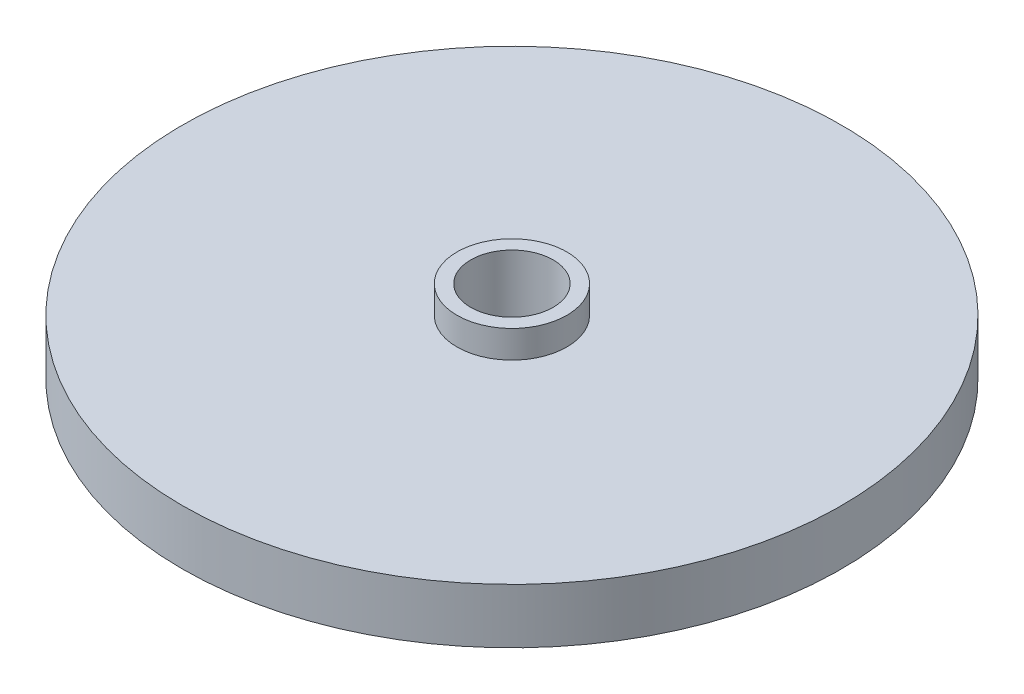
ISO-10303-21;
HEADER;
FILE_DESCRIPTION(('STEP AP214'),'2;1');
FILE_NAME('part.step','',(''),(''),'','','');
FILE_SCHEMA(('AUTOMOTIVE_DESIGN { 1 0 10303 214 1 1 1 1 }'));
ENDSEC;
DATA;
#1=APPLICATION_CONTEXT('core data for automotive mechanical design processes');
#2=APPLICATION_PROTOCOL_DEFINITION('international standard','automotive_design',2000,#1);
#3=PRODUCT_CONTEXT('',#1,'mechanical');
#4=PRODUCT('Part','Part','',(#3));
#5=PRODUCT_RELATED_PRODUCT_CATEGORY('part','',(#4));
#6=PRODUCT_DEFINITION_FORMATION('','',#4);
#7=PRODUCT_DEFINITION_CONTEXT('part definition',#1,'design');
#8=PRODUCT_DEFINITION('design','',#6,#7);
#9=PRODUCT_DEFINITION_SHAPE('','',#8);
#10=(LENGTH_UNIT() NAMED_UNIT(*) SI_UNIT(.MILLI.,.METRE.));
#11=(NAMED_UNIT(*) PLANE_ANGLE_UNIT() SI_UNIT($,.RADIAN.));
#12=(NAMED_UNIT(*) SI_UNIT($,.STERADIAN.) SOLID_ANGLE_UNIT());
#13=UNCERTAINTY_MEASURE_WITH_UNIT(LENGTH_MEASURE(1.E-05),#10,'distance_accuracy_value','');
#14=(GEOMETRIC_REPRESENTATION_CONTEXT(3) GLOBAL_UNCERTAINTY_ASSIGNED_CONTEXT((#13)) GLOBAL_UNIT_ASSIGNED_CONTEXT((#10,
#11,#12)) REPRESENTATION_CONTEXT('',''));
#15=CARTESIAN_POINT('',(0.,0.,0.));
#16=DIRECTION('',(0.,0.,1.));
#17=DIRECTION('',(1.,0.,0.));
#18=AXIS2_PLACEMENT_3D('',#15,#16,#17);
#19=CARTESIAN_POINT('',(0.,-2.,0.));
#20=DIRECTION('',(0.,1.,0.));
#21=DIRECTION('',(0.,0.,1.));
#22=AXIS2_PLACEMENT_3D('',#19,#20,#21);
#23=CYLINDRICAL_SURFACE('',#22,12.);
#24=CARTESIAN_POINT('',(0.,-2.,0.));
#25=DIRECTION('',(0.,1.,0.));
#26=DIRECTION('',(0.,0.,1.));
#27=AXIS2_PLACEMENT_3D('',#24,#25,#26);
#28=CIRCLE('',#27,12.);
#29=CARTESIAN_POINT('',(0.,-2.,12.));
#30=VERTEX_POINT('',#29);
#31=EDGE_CURVE('E43',#30,#30,#28,.T.);
#32=ORIENTED_EDGE('',*,*,#31,.T.);
#33=EDGE_LOOP('',(#32));
#34=FACE_BOUND('',#33,.T.);
#35=CARTESIAN_POINT('',(0.,0.,0.));
#36=DIRECTION('',(0.,1.,0.));
#37=DIRECTION('',(0.,0.,1.));
#38=AXIS2_PLACEMENT_3D('',#35,#36,#37);
#39=CIRCLE('',#38,12.);
#40=CARTESIAN_POINT('',(0.,0.,12.));
#41=VERTEX_POINT('',#40);
#42=EDGE_CURVE('E39',#41,#41,#39,.T.);
#43=ORIENTED_EDGE('',*,*,#42,.F.);
#44=EDGE_LOOP('',(#43));
#45=FACE_BOUND('',#44,.T.);
#46=ADVANCED_FACE('F36',(#34,#45),#23,.T.);
#47=CARTESIAN_POINT('',(0.,-2.,0.));
#48=DIRECTION('',(0.,1.,0.));
#49=DIRECTION('',(0.,0.,1.));
#50=AXIS2_PLACEMENT_3D('',#47,#48,#49);
#51=PLANE('',#50);
#52=CARTESIAN_POINT('',(0.,-2.,0.));
#53=DIRECTION('',(0.,-1.,0.));
#54=DIRECTION('',(0.,0.,-1.));
#55=AXIS2_PLACEMENT_3D('',#52,#53,#54);
#56=CIRCLE('',#55,4.5);
#57=CARTESIAN_POINT('',(0.,-2.,-4.5));
#58=VERTEX_POINT('',#57);
#59=EDGE_CURVE('E10',#58,#58,#56,.T.);
#60=ORIENTED_EDGE('',*,*,#59,.F.);
#61=EDGE_LOOP('',(#60));
#62=FACE_BOUND('',#61,.T.);
#63=ORIENTED_EDGE('',*,*,#31,.F.);
#64=EDGE_LOOP('',(#63));
#65=FACE_BOUND('',#64,.T.);
#66=ADVANCED_FACE('F84',(#62,#65),#51,.F.);
#67=CARTESIAN_POINT('',(0.,0.,0.));
#68=DIRECTION('',(0.,1.,0.));
#69=DIRECTION('',(0.,0.,1.));
#70=AXIS2_PLACEMENT_3D('',#67,#68,#69);
#71=PLANE('',#70);
#72=CARTESIAN_POINT('',(0.,0.,0.));
#73=DIRECTION('',(0.,1.,0.));
#74=DIRECTION('',(0.,0.,1.));
#75=AXIS2_PLACEMENT_3D('',#72,#73,#74);
#76=CIRCLE('',#75,2.);
#77=CARTESIAN_POINT('',(0.,0.,2.));
#78=VERTEX_POINT('',#77);
#79=EDGE_CURVE('E56',#78,#78,#76,.T.);
#80=ORIENTED_EDGE('',*,*,#79,.F.);
#81=EDGE_LOOP('',(#80));
#82=FACE_BOUND('',#81,.T.);
#83=ORIENTED_EDGE('',*,*,#42,.T.);
#84=EDGE_LOOP('',(#83));
#85=FACE_BOUND('',#84,.T.);
#86=ADVANCED_FACE('F89',(#82,#85),#71,.T.);
#87=CARTESIAN_POINT('',(0.,-4.,0.));
#88=DIRECTION('',(0.,1.,0.));
#89=DIRECTION('',(0.,0.,1.));
#90=AXIS2_PLACEMENT_3D('',#87,#88,#89);
#91=CYLINDRICAL_SURFACE('',#90,4.5);
#92=CARTESIAN_POINT('',(0.,-4.,0.));
#93=DIRECTION('',(0.,-1.,0.));
#94=DIRECTION('',(0.,0.,-1.));
#95=AXIS2_PLACEMENT_3D('',#92,#93,#94);
#96=CIRCLE('',#95,4.5);
#97=CARTESIAN_POINT('',(0.,-4.,-4.5));
#98=VERTEX_POINT('',#97);
#99=EDGE_CURVE('E49',#98,#98,#96,.T.);
#100=ORIENTED_EDGE('',*,*,#99,.F.);
#101=EDGE_LOOP('',(#100));
#102=FACE_BOUND('',#101,.T.);
#103=ORIENTED_EDGE('',*,*,#59,.T.);
#104=EDGE_LOOP('',(#103));
#105=FACE_BOUND('',#104,.T.);
#106=ADVANCED_FACE('F80',(#102,#105),#91,.T.);
#107=CARTESIAN_POINT('',(0.,-4.,0.));
#108=DIRECTION('',(0.,-1.,0.));
#109=DIRECTION('',(0.,0.,-1.));
#110=AXIS2_PLACEMENT_3D('',#107,#108,#109);
#111=PLANE('',#110);
#112=CARTESIAN_POINT('',(0.,-4.,0.));
#113=DIRECTION('',(0.,-1.,0.));
#114=DIRECTION('',(0.,0.,-1.));
#115=AXIS2_PLACEMENT_3D('',#112,#113,#114);
#116=CIRCLE('',#115,1.5);
#117=CARTESIAN_POINT('',(0.,-4.,-1.5));
#118=VERTEX_POINT('',#117);
#119=EDGE_CURVE('E52',#118,#118,#116,.T.);
#120=ORIENTED_EDGE('',*,*,#119,.F.);
#121=EDGE_LOOP('',(#120));
#122=FACE_BOUND('',#121,.T.);
#123=ORIENTED_EDGE('',*,*,#99,.T.);
#124=EDGE_LOOP('',(#123));
#125=FACE_BOUND('',#124,.T.);
#126=ADVANCED_FACE('F71',(#122,#125),#111,.T.);
#127=CARTESIAN_POINT('',(0.,0.,0.));
#128=DIRECTION('',(0.,-1.,0.));
#129=DIRECTION('',(0.,0.,-1.));
#130=AXIS2_PLACEMENT_3D('',#127,#128,#129);
#131=CYLINDRICAL_SURFACE('',#130,1.5);
#132=ORIENTED_EDGE('',*,*,#119,.T.);
#133=EDGE_LOOP('',(#132));
#134=FACE_BOUND('',#133,.T.);
#135=CARTESIAN_POINT('',(0.,1.,0.));
#136=DIRECTION('',(0.,1.,0.));
#137=DIRECTION('',(0.,0.,1.));
#138=AXIS2_PLACEMENT_3D('',#135,#136,#137);
#139=CIRCLE('',#138,1.5);
#140=CARTESIAN_POINT('',(0.,1.,1.5));
#141=VERTEX_POINT('',#140);
#142=EDGE_CURVE('E59',#141,#141,#139,.F.);
#143=ORIENTED_EDGE('',*,*,#142,.F.);
#144=EDGE_LOOP('',(#143));
#145=FACE_BOUND('',#144,.T.);
#146=ADVANCED_FACE('F68',(#134,#145),#131,.F.);
#147=CARTESIAN_POINT('',(0.,1.,0.));
#148=DIRECTION('',(0.,-1.,0.));
#149=DIRECTION('',(0.,0.,-1.));
#150=AXIS2_PLACEMENT_3D('',#147,#148,#149);
#151=CYLINDRICAL_SURFACE('',#150,2.);
#152=CARTESIAN_POINT('',(0.,1.,0.));
#153=DIRECTION('',(0.,1.,0.));
#154=DIRECTION('',(0.,0.,1.));
#155=AXIS2_PLACEMENT_3D('',#152,#153,#154);
#156=CIRCLE('',#155,2.);
#157=CARTESIAN_POINT('',(0.,1.,2.));
#158=VERTEX_POINT('',#157);
#159=EDGE_CURVE('E55',#158,#158,#156,.T.);
#160=ORIENTED_EDGE('',*,*,#159,.F.);
#161=EDGE_LOOP('',(#160));
#162=FACE_BOUND('',#161,.T.);
#163=ORIENTED_EDGE('',*,*,#79,.T.);
#164=EDGE_LOOP('',(#163));
#165=FACE_BOUND('',#164,.T.);
#166=ADVANCED_FACE('F70',(#162,#165),#151,.T.);
#167=CARTESIAN_POINT('',(0.,1.,0.));
#168=DIRECTION('',(0.,1.,0.));
#169=DIRECTION('',(0.,0.,1.));
#170=AXIS2_PLACEMENT_3D('',#167,#168,#169);
#171=PLANE('',#170);
#172=ORIENTED_EDGE('',*,*,#142,.T.);
#173=EDGE_LOOP('',(#172));
#174=FACE_BOUND('',#173,.T.);
#175=ORIENTED_EDGE('',*,*,#159,.T.);
#176=EDGE_LOOP('',(#175));
#177=FACE_BOUND('',#176,.T.);
#178=ADVANCED_FACE('F65',(#174,#177),#171,.T.);
#179=CLOSED_SHELL('',(#46,#66,#86,#106,#126,#146,#166,#178));
#180=MANIFOLD_SOLID_BREP('B2',#179);
#181=ADVANCED_BREP_SHAPE_REPRESENTATION('',(#18,#180),#14);
#182=SHAPE_DEFINITION_REPRESENTATION(#9,#181);
ENDSEC;
END-ISO-10303-21;
